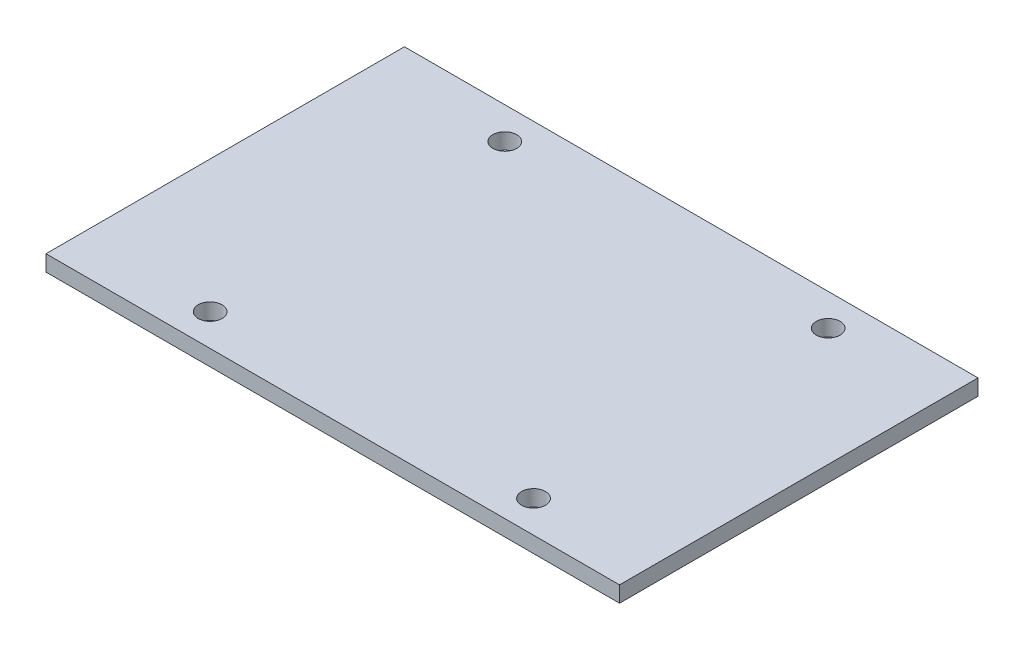
ISO-10303-21;
HEADER;
FILE_DESCRIPTION(('STEP AP214'),'2;1');
FILE_NAME('part.step','',(''),(''),'','','');
FILE_SCHEMA(('AUTOMOTIVE_DESIGN { 1 0 10303 214 1 1 1 1 }'));
ENDSEC;
DATA;
#1=APPLICATION_CONTEXT('core data for automotive mechanical design processes');
#2=APPLICATION_PROTOCOL_DEFINITION('international standard','automotive_design',2000,#1);
#3=PRODUCT_CONTEXT('',#1,'mechanical');
#4=PRODUCT('Part','Part','',(#3));
#5=PRODUCT_RELATED_PRODUCT_CATEGORY('part','',(#4));
#6=PRODUCT_DEFINITION_FORMATION('','',#4);
#7=PRODUCT_DEFINITION_CONTEXT('part definition',#1,'design');
#8=PRODUCT_DEFINITION('design','',#6,#7);
#9=PRODUCT_DEFINITION_SHAPE('','',#8);
#10=(LENGTH_UNIT() NAMED_UNIT(*) SI_UNIT(.MILLI.,.METRE.));
#11=(NAMED_UNIT(*) PLANE_ANGLE_UNIT() SI_UNIT($,.RADIAN.));
#12=(NAMED_UNIT(*) SI_UNIT($,.STERADIAN.) SOLID_ANGLE_UNIT());
#13=UNCERTAINTY_MEASURE_WITH_UNIT(LENGTH_MEASURE(1.E-05),#10,'distance_accuracy_value','');
#14=(GEOMETRIC_REPRESENTATION_CONTEXT(3) GLOBAL_UNCERTAINTY_ASSIGNED_CONTEXT((#13)) GLOBAL_UNIT_ASSIGNED_CONTEXT((#10,
#11,#12)) REPRESENTATION_CONTEXT('',''));
#15=CARTESIAN_POINT('',(0.,0.,0.));
#16=DIRECTION('',(0.,0.,1.));
#17=DIRECTION('',(1.,0.,0.));
#18=AXIS2_PLACEMENT_3D('',#15,#16,#17);
#19=CARTESIAN_POINT('',(36.,2.,22.5));
#20=DIRECTION('',(-1.,0.,0.));
#21=DIRECTION('',(0.,0.,1.));
#22=AXIS2_PLACEMENT_3D('',#19,#20,#21);
#23=PLANE('',#22);
#24=DIRECTION('',(0.,0.,-1.));
#25=VECTOR('',#24,1.);
#26=CARTESIAN_POINT('',(36.,0.,22.5));
#27=LINE('',#26,#25);
#28=CARTESIAN_POINT('',(36.,0.,22.5));
#29=VERTEX_POINT('',#28);
#30=CARTESIAN_POINT('',(36.,0.,-22.5));
#31=VERTEX_POINT('',#30);
#32=EDGE_CURVE('E113',#29,#31,#27,.T.);
#33=ORIENTED_EDGE('',*,*,#32,.T.);
#34=DIRECTION('',(0.,-1.,0.));
#35=VECTOR('',#34,1.);
#36=CARTESIAN_POINT('',(36.,2.,-22.5));
#37=LINE('',#36,#35);
#38=CARTESIAN_POINT('',(36.,2.,-22.5));
#39=VERTEX_POINT('',#38);
#40=EDGE_CURVE('E11',#39,#31,#37,.T.);
#41=ORIENTED_EDGE('',*,*,#40,.F.);
#42=DIRECTION('',(0.,0.,-1.));
#43=VECTOR('',#42,1.);
#44=CARTESIAN_POINT('',(36.,2.,22.5));
#45=LINE('',#44,#43);
#46=CARTESIAN_POINT('',(36.,2.,22.5));
#47=VERTEX_POINT('',#46);
#48=EDGE_CURVE('E97',#47,#39,#45,.T.);
#49=ORIENTED_EDGE('',*,*,#48,.F.);
#50=DIRECTION('',(0.,-1.,0.));
#51=VECTOR('',#50,1.);
#52=CARTESIAN_POINT('',(36.,2.,22.5));
#53=LINE('',#52,#51);
#54=EDGE_CURVE('E109',#47,#29,#53,.T.);
#55=ORIENTED_EDGE('',*,*,#54,.T.);
#56=EDGE_LOOP('',(#33,#41,#49,#55));
#57=FACE_BOUND('',#56,.T.);
#58=ADVANCED_FACE('F45',(#57),#23,.F.);
#59=CARTESIAN_POINT('',(-36.,2.,-22.5));
#60=DIRECTION('',(0.,0.,1.));
#61=DIRECTION('',(1.,0.,0.));
#62=AXIS2_PLACEMENT_3D('',#59,#60,#61);
#63=PLANE('',#62);
#64=DIRECTION('',(-1.,0.,0.));
#65=VECTOR('',#64,1.);
#66=CARTESIAN_POINT('',(-36.,0.,-22.5));
#67=LINE('',#66,#65);
#68=CARTESIAN_POINT('',(-36.,0.,-22.5));
#69=VERTEX_POINT('',#68);
#70=EDGE_CURVE('E102',#31,#69,#67,.T.);
#71=ORIENTED_EDGE('',*,*,#70,.T.);
#72=DIRECTION('',(0.,-1.,0.));
#73=VECTOR('',#72,1.);
#74=CARTESIAN_POINT('',(-36.,2.,-22.5));
#75=LINE('',#74,#73);
#76=CARTESIAN_POINT('',(-36.,2.,-22.5));
#77=VERTEX_POINT('',#76);
#78=EDGE_CURVE('E54',#77,#69,#75,.T.);
#79=ORIENTED_EDGE('',*,*,#78,.F.);
#80=DIRECTION('',(-1.,0.,0.));
#81=VECTOR('',#80,1.);
#82=CARTESIAN_POINT('',(-36.,2.,-22.5));
#83=LINE('',#82,#81);
#84=EDGE_CURVE('E92',#39,#77,#83,.T.);
#85=ORIENTED_EDGE('',*,*,#84,.F.);
#86=ORIENTED_EDGE('',*,*,#40,.T.);
#87=EDGE_LOOP('',(#71,#79,#85,#86));
#88=FACE_BOUND('',#87,.T.);
#89=ADVANCED_FACE('F101',(#88),#63,.F.);
#90=CARTESIAN_POINT('',(-36.,2.,22.5));
#91=DIRECTION('',(1.,0.,0.));
#92=DIRECTION('',(0.,0.,-1.));
#93=AXIS2_PLACEMENT_3D('',#90,#91,#92);
#94=PLANE('',#93);
#95=DIRECTION('',(0.,0.,1.));
#96=VECTOR('',#95,1.);
#97=CARTESIAN_POINT('',(-36.,0.,22.5));
#98=LINE('',#97,#96);
#99=CARTESIAN_POINT('',(-36.,0.,22.5));
#100=VERTEX_POINT('',#99);
#101=EDGE_CURVE('E79',#69,#100,#98,.T.);
#102=ORIENTED_EDGE('',*,*,#101,.T.);
#103=DIRECTION('',(0.,-1.,0.));
#104=VECTOR('',#103,1.);
#105=CARTESIAN_POINT('',(-36.,2.,22.5));
#106=LINE('',#105,#104);
#107=CARTESIAN_POINT('',(-36.,2.,22.5));
#108=VERTEX_POINT('',#107);
#109=EDGE_CURVE('E104',#108,#100,#106,.T.);
#110=ORIENTED_EDGE('',*,*,#109,.F.);
#111=DIRECTION('',(0.,0.,1.));
#112=VECTOR('',#111,1.);
#113=CARTESIAN_POINT('',(-36.,2.,22.5));
#114=LINE('',#113,#112);
#115=EDGE_CURVE('E95',#77,#108,#114,.T.);
#116=ORIENTED_EDGE('',*,*,#115,.F.);
#117=ORIENTED_EDGE('',*,*,#78,.T.);
#118=EDGE_LOOP('',(#102,#110,#116,#117));
#119=FACE_BOUND('',#118,.T.);
#120=ADVANCED_FACE('F105',(#119),#94,.F.);
#121=CARTESIAN_POINT('',(-36.,2.,22.5));
#122=DIRECTION('',(0.,0.,-1.));
#123=DIRECTION('',(-1.,0.,0.));
#124=AXIS2_PLACEMENT_3D('',#121,#122,#123);
#125=PLANE('',#124);
#126=DIRECTION('',(1.,0.,0.));
#127=VECTOR('',#126,1.);
#128=CARTESIAN_POINT('',(-36.,0.,22.5));
#129=LINE('',#128,#127);
#130=EDGE_CURVE('E85',#100,#29,#129,.T.);
#131=ORIENTED_EDGE('',*,*,#130,.T.);
#132=ORIENTED_EDGE('',*,*,#54,.F.);
#133=DIRECTION('',(1.,0.,0.));
#134=VECTOR('',#133,1.);
#135=CARTESIAN_POINT('',(-36.,2.,22.5));
#136=LINE('',#135,#134);
#137=EDGE_CURVE('E62',#108,#47,#136,.T.);
#138=ORIENTED_EDGE('',*,*,#137,.F.);
#139=ORIENTED_EDGE('',*,*,#109,.T.);
#140=EDGE_LOOP('',(#131,#132,#138,#139));
#141=FACE_BOUND('',#140,.T.);
#142=ADVANCED_FACE('F127',(#141),#125,.F.);
#143=CARTESIAN_POINT('',(0.,2.,0.));
#144=DIRECTION('',(0.,-1.,0.));
#145=DIRECTION('',(0.,0.,-1.));
#146=AXIS2_PLACEMENT_3D('',#143,#144,#145);
#147=PLANE('',#146);
#148=CARTESIAN_POINT('',(-19.4,2.,-18.495));
#149=DIRECTION('',(0.,1.,0.));
#150=DIRECTION('',(0.,0.,1.));
#151=AXIS2_PLACEMENT_3D('',#148,#149,#150);
#152=CIRCLE('',#151,1.5);
#153=CARTESIAN_POINT('',(-19.4,2.,-16.995));
#154=VERTEX_POINT('',#153);
#155=EDGE_CURVE('E142',#154,#154,#152,.T.);
#156=ORIENTED_EDGE('',*,*,#155,.F.);
#157=EDGE_LOOP('',(#156));
#158=FACE_BOUND('',#157,.T.);
#159=CARTESIAN_POINT('',(-19.4,2.,18.495));
#160=DIRECTION('',(0.,1.,0.));
#161=DIRECTION('',(0.,0.,1.));
#162=AXIS2_PLACEMENT_3D('',#159,#160,#161);
#163=CIRCLE('',#162,1.5);
#164=CARTESIAN_POINT('',(-19.4,2.,19.995));
#165=VERTEX_POINT('',#164);
#166=EDGE_CURVE('E150',#165,#165,#163,.T.);
#167=ORIENTED_EDGE('',*,*,#166,.F.);
#168=EDGE_LOOP('',(#167));
#169=FACE_BOUND('',#168,.T.);
#170=CARTESIAN_POINT('',(21.2,2.,18.495));
#171=DIRECTION('',(0.,1.,0.));
#172=DIRECTION('',(0.,0.,1.));
#173=AXIS2_PLACEMENT_3D('',#170,#171,#172);
#174=CIRCLE('',#173,1.50000000000001);
#175=CARTESIAN_POINT('',(21.2,2.,19.995));
#176=VERTEX_POINT('',#175);
#177=EDGE_CURVE('E158',#176,#176,#174,.T.);
#178=ORIENTED_EDGE('',*,*,#177,.F.);
#179=EDGE_LOOP('',(#178));
#180=FACE_BOUND('',#179,.T.);
#181=CARTESIAN_POINT('',(21.2,2.,-18.495));
#182=DIRECTION('',(0.,1.,0.));
#183=DIRECTION('',(0.,0.,1.));
#184=AXIS2_PLACEMENT_3D('',#181,#182,#183);
#185=CIRCLE('',#184,1.50000000000001);
#186=CARTESIAN_POINT('',(21.2,2.,-16.995));
#187=VERTEX_POINT('',#186);
#188=EDGE_CURVE('E134',#187,#187,#185,.T.);
#189=ORIENTED_EDGE('',*,*,#188,.F.);
#190=EDGE_LOOP('',(#189));
#191=FACE_BOUND('',#190,.T.);
#192=ORIENTED_EDGE('',*,*,#48,.T.);
#193=ORIENTED_EDGE('',*,*,#84,.T.);
#194=ORIENTED_EDGE('',*,*,#115,.T.);
#195=ORIENTED_EDGE('',*,*,#137,.T.);
#196=EDGE_LOOP('',(#192,#193,#194,#195));
#197=FACE_BOUND('',#196,.T.);
#198=ADVANCED_FACE('F93',(#158,#169,#180,#191,#197),#147,.F.);
#199=CARTESIAN_POINT('',(0.,0.,0.));
#200=DIRECTION('',(0.,-1.,0.));
#201=DIRECTION('',(0.,0.,-1.));
#202=AXIS2_PLACEMENT_3D('',#199,#200,#201);
#203=PLANE('',#202);
#204=CARTESIAN_POINT('',(-19.4,0.,-18.495));
#205=DIRECTION('',(0.,1.,0.));
#206=DIRECTION('',(0.,0.,1.));
#207=AXIS2_PLACEMENT_3D('',#204,#205,#206);
#208=CIRCLE('',#207,1.5);
#209=CARTESIAN_POINT('',(-19.4,0.,-16.995));
#210=VERTEX_POINT('',#209);
#211=EDGE_CURVE('E146',#210,#210,#208,.T.);
#212=ORIENTED_EDGE('',*,*,#211,.T.);
#213=EDGE_LOOP('',(#212));
#214=FACE_BOUND('',#213,.T.);
#215=CARTESIAN_POINT('',(-19.4,0.,18.495));
#216=DIRECTION('',(0.,1.,0.));
#217=DIRECTION('',(0.,0.,1.));
#218=AXIS2_PLACEMENT_3D('',#215,#216,#217);
#219=CIRCLE('',#218,1.5);
#220=CARTESIAN_POINT('',(-19.4,0.,19.995));
#221=VERTEX_POINT('',#220);
#222=EDGE_CURVE('E154',#221,#221,#219,.T.);
#223=ORIENTED_EDGE('',*,*,#222,.T.);
#224=EDGE_LOOP('',(#223));
#225=FACE_BOUND('',#224,.T.);
#226=CARTESIAN_POINT('',(21.2,0.,18.495));
#227=DIRECTION('',(0.,1.,0.));
#228=DIRECTION('',(0.,0.,1.));
#229=AXIS2_PLACEMENT_3D('',#226,#227,#228);
#230=CIRCLE('',#229,1.50000000000001);
#231=CARTESIAN_POINT('',(21.2,0.,19.995));
#232=VERTEX_POINT('',#231);
#233=EDGE_CURVE('E138',#232,#232,#230,.T.);
#234=ORIENTED_EDGE('',*,*,#233,.T.);
#235=EDGE_LOOP('',(#234));
#236=FACE_BOUND('',#235,.T.);
#237=CARTESIAN_POINT('',(21.2,0.,-18.495));
#238=DIRECTION('',(0.,1.,0.));
#239=DIRECTION('',(0.,0.,1.));
#240=AXIS2_PLACEMENT_3D('',#237,#238,#239);
#241=CIRCLE('',#240,1.50000000000001);
#242=CARTESIAN_POINT('',(21.2,0.,-16.995));
#243=VERTEX_POINT('',#242);
#244=EDGE_CURVE('E117',#243,#243,#241,.T.);
#245=ORIENTED_EDGE('',*,*,#244,.T.);
#246=EDGE_LOOP('',(#245));
#247=FACE_BOUND('',#246,.T.);
#248=ORIENTED_EDGE('',*,*,#32,.F.);
#249=ORIENTED_EDGE('',*,*,#130,.F.);
#250=ORIENTED_EDGE('',*,*,#101,.F.);
#251=ORIENTED_EDGE('',*,*,#70,.F.);
#252=EDGE_LOOP('',(#248,#249,#250,#251));
#253=FACE_BOUND('',#252,.T.);
#254=ADVANCED_FACE('F130',(#214,#225,#236,#247,#253),#203,.T.);
#255=CARTESIAN_POINT('',(21.2,0.,-18.495));
#256=DIRECTION('',(0.,1.,0.));
#257=DIRECTION('',(0.,0.,1.));
#258=AXIS2_PLACEMENT_3D('',#255,#256,#257);
#259=CYLINDRICAL_SURFACE('',#258,1.50000000000001);
#260=ORIENTED_EDGE('',*,*,#244,.F.);
#261=EDGE_LOOP('',(#260));
#262=FACE_BOUND('',#261,.T.);
#263=ORIENTED_EDGE('',*,*,#188,.T.);
#264=EDGE_LOOP('',(#263));
#265=FACE_BOUND('',#264,.T.);
#266=ADVANCED_FACE('F172',(#262,#265),#259,.F.);
#267=CARTESIAN_POINT('',(21.2,0.,18.495));
#268=DIRECTION('',(0.,1.,0.));
#269=DIRECTION('',(0.,0.,1.));
#270=AXIS2_PLACEMENT_3D('',#267,#268,#269);
#271=CYLINDRICAL_SURFACE('',#270,1.50000000000001);
#272=ORIENTED_EDGE('',*,*,#233,.F.);
#273=EDGE_LOOP('',(#272));
#274=FACE_BOUND('',#273,.T.);
#275=ORIENTED_EDGE('',*,*,#177,.T.);
#276=EDGE_LOOP('',(#275));
#277=FACE_BOUND('',#276,.T.);
#278=ADVANCED_FACE('F168',(#274,#277),#271,.F.);
#279=CARTESIAN_POINT('',(-19.4,0.,18.495));
#280=DIRECTION('',(0.,1.,0.));
#281=DIRECTION('',(0.,0.,1.));
#282=AXIS2_PLACEMENT_3D('',#279,#280,#281);
#283=CYLINDRICAL_SURFACE('',#282,1.5);
#284=ORIENTED_EDGE('',*,*,#222,.F.);
#285=EDGE_LOOP('',(#284));
#286=FACE_BOUND('',#285,.T.);
#287=ORIENTED_EDGE('',*,*,#166,.T.);
#288=EDGE_LOOP('',(#287));
#289=FACE_BOUND('',#288,.T.);
#290=ADVANCED_FACE('F171',(#286,#289),#283,.F.);
#291=CARTESIAN_POINT('',(-19.4,0.,-18.495));
#292=DIRECTION('',(0.,1.,0.));
#293=DIRECTION('',(0.,0.,1.));
#294=AXIS2_PLACEMENT_3D('',#291,#292,#293);
#295=CYLINDRICAL_SURFACE('',#294,1.5);
#296=ORIENTED_EDGE('',*,*,#211,.F.);
#297=EDGE_LOOP('',(#296));
#298=FACE_BOUND('',#297,.T.);
#299=ORIENTED_EDGE('',*,*,#155,.T.);
#300=EDGE_LOOP('',(#299));
#301=FACE_BOUND('',#300,.T.);
#302=ADVANCED_FACE('F236',(#298,#301),#295,.F.);
#303=CLOSED_SHELL('',(#58,#89,#120,#142,#198,#254,#266,#278,#290,#302));
#304=MANIFOLD_SOLID_BREP('B2',#303);
#305=ADVANCED_BREP_SHAPE_REPRESENTATION('',(#18,#304),#14);
#306=SHAPE_DEFINITION_REPRESENTATION(#9,#305);
ENDSEC;
END-ISO-10303-21;
